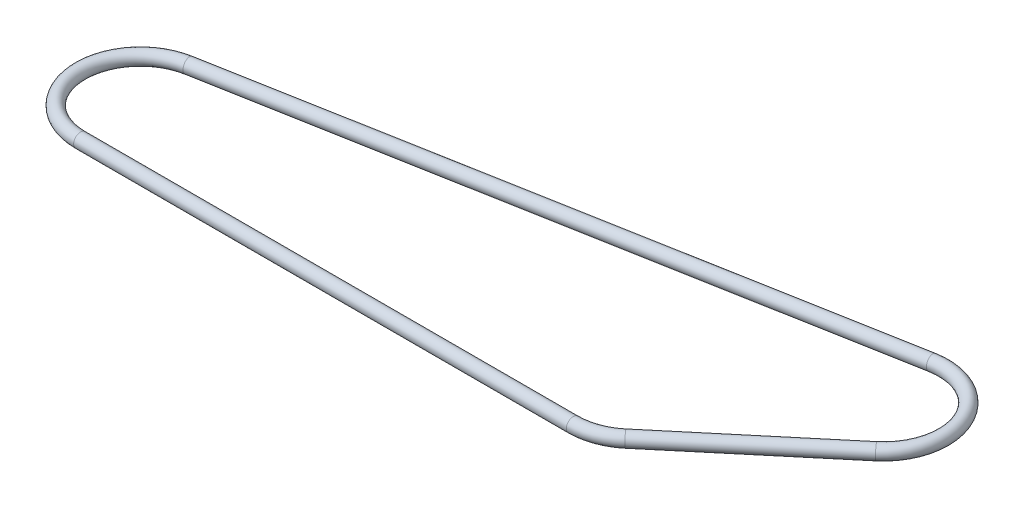
ISO-10303-21;
HEADER;
FILE_DESCRIPTION(('STEP AP214'),'2;1');
FILE_NAME('part.step','',(''),(''),'','','');
FILE_SCHEMA(('AUTOMOTIVE_DESIGN { 1 0 10303 214 1 1 1 1 }'));
ENDSEC;
DATA;
#1=APPLICATION_CONTEXT('core data for automotive mechanical design processes');
#2=APPLICATION_PROTOCOL_DEFINITION('international standard','automotive_design',2000,#1);
#3=PRODUCT_CONTEXT('',#1,'mechanical');
#4=PRODUCT('Part','Part','',(#3));
#5=PRODUCT_RELATED_PRODUCT_CATEGORY('part','',(#4));
#6=PRODUCT_DEFINITION_FORMATION('','',#4);
#7=PRODUCT_DEFINITION_CONTEXT('part definition',#1,'design');
#8=PRODUCT_DEFINITION('design','',#6,#7);
#9=PRODUCT_DEFINITION_SHAPE('','',#8);
#10=(LENGTH_UNIT() NAMED_UNIT(*) SI_UNIT(.MILLI.,.METRE.));
#11=(NAMED_UNIT(*) PLANE_ANGLE_UNIT() SI_UNIT($,.RADIAN.));
#12=(NAMED_UNIT(*) SI_UNIT($,.STERADIAN.) SOLID_ANGLE_UNIT());
#13=UNCERTAINTY_MEASURE_WITH_UNIT(LENGTH_MEASURE(1.E-05),#10,'distance_accuracy_value','');
#14=(GEOMETRIC_REPRESENTATION_CONTEXT(3) GLOBAL_UNCERTAINTY_ASSIGNED_CONTEXT((#13)) GLOBAL_UNIT_ASSIGNED_CONTEXT((#10,
#11,#12)) REPRESENTATION_CONTEXT('',''));
#15=CARTESIAN_POINT('',(0.,0.,0.));
#16=DIRECTION('',(0.,0.,1.));
#17=DIRECTION('',(1.,0.,0.));
#18=AXIS2_PLACEMENT_3D('',#15,#16,#17);
#19=CARTESIAN_POINT('',(228.6,0.,0.));
#20=DIRECTION('',(-1.,0.,0.));
#21=DIRECTION('',(0.,0.,1.));
#22=AXIS2_PLACEMENT_3D('',#19,#20,#21);
#23=CYLINDRICAL_SURFACE('',#22,3.175);
#24=CARTESIAN_POINT('',(228.6,0.,0.));
#25=DIRECTION('',(1.,0.,0.));
#26=DIRECTION('',(0.,0.,-1.));
#27=AXIS2_PLACEMENT_3D('',#24,#25,#26);
#28=CIRCLE('',#27,3.175);
#29=CARTESIAN_POINT('',(228.6,0.,-3.175));
#30=VERTEX_POINT('',#29);
#31=EDGE_CURVE('E12',#30,#30,#28,.T.);
#32=ORIENTED_EDGE('',*,*,#31,.F.);
#33=EDGE_LOOP('',(#32));
#34=FACE_BOUND('',#33,.T.);
#35=CARTESIAN_POINT('',(0.,0.,0.));
#36=DIRECTION('',(1.,0.,0.));
#37=DIRECTION('',(0.,0.,-1.));
#38=AXIS2_PLACEMENT_3D('',#35,#36,#37);
#39=CIRCLE('',#38,3.175);
#40=CARTESIAN_POINT('',(0.,0.,-3.175));
#41=VERTEX_POINT('',#40);
#42=CARTESIAN_POINT('',(-1.72387306772911E-06,3.175,-4.51320987310372E-12));
#43=VERTEX_POINT('',#42);
#44=EDGE_CURVE('E52',#41,#43,#39,.T.);
#45=ORIENTED_EDGE('',*,*,#44,.T.);
#46=CARTESIAN_POINT('',(-1.72387306773131E-06,0.,-4.57966997657877E-13));
#47=DIRECTION('',(0.999999999999853,0.,5.42952153376186E-07));
#48=DIRECTION('',(5.4295215334843E-07,0.,-0.999999999999853));
#49=AXIS2_PLACEMENT_3D('',#46,#47,#48);
#50=CIRCLE('',#49,3.175);
#51=EDGE_CURVE('E64',#43,#41,#50,.T.);
#52=ORIENTED_EDGE('',*,*,#51,.T.);
#53=EDGE_LOOP('',(#45,#52));
#54=FACE_BOUND('',#53,.T.);
#55=ADVANCED_FACE('F49',(#34,#54),#23,.T.);
#56=CARTESIAN_POINT('',(228.59999994985,0.,-27.78125));
#57=DIRECTION('',(0.,1.,0.));
#58=DIRECTION('',(0.,0.,1.));
#59=AXIS2_PLACEMENT_3D('',#56,#57,#58);
#60=TOROIDAL_SURFACE('',#59,27.78125,3.175);
#61=CARTESIAN_POINT('',(246.457443372482,0.,-6.49957793293729));
#62=DIRECTION('',(0.766044440019752,0.,-0.642787613380054));
#63=DIRECTION('',(-0.642787613380054,0.,-0.766044440019752));
#64=AXIS2_PLACEMENT_3D('',#61,#62,#63);
#65=CIRCLE('',#64,3.175);
#66=CARTESIAN_POINT('',(244.4165927,0.,-8.93176903));
#67=VERTEX_POINT('',#66);
#68=EDGE_CURVE('E70',#67,#67,#65,.T.);
#69=ORIENTED_EDGE('',*,*,#68,.F.);
#70=EDGE_LOOP('',(#69));
#71=FACE_BOUND('',#70,.T.);
#72=ORIENTED_EDGE('',*,*,#31,.T.);
#73=EDGE_LOOP('',(#72));
#74=FACE_BOUND('',#73,.T.);
#75=ADVANCED_FACE('F99',(#71,#74),#60,.T.);
#76=CARTESIAN_POINT('',(309.694411896112,0.,-59.5616954174608));
#77=DIRECTION('',(-0.766044440019751,0.,0.642787613380054));
#78=DIRECTION('',(0.642787613380054,0.,0.766044440019752));
#79=AXIS2_PLACEMENT_3D('',#76,#77,#78);
#80=CYLINDRICAL_SURFACE('',#79,3.17499999999998);
#81=CARTESIAN_POINT('',(309.694411896112,0.,-59.5616954174608));
#82=DIRECTION('',(0.766044440019751,0.,-0.642787613380054));
#83=DIRECTION('',(-0.642787613380054,0.,-0.766044440019751));
#84=AXIS2_PLACEMENT_3D('',#81,#82,#83);
#85=CIRCLE('',#84,3.17499999999998);
#86=CARTESIAN_POINT('',(311.735262570184,0.,-57.1295043217326));
#87=VERTEX_POINT('',#86);
#88=EDGE_CURVE('E72',#87,#87,#85,.T.);
#89=ORIENTED_EDGE('',*,*,#88,.F.);
#90=EDGE_LOOP('',(#89));
#91=FACE_BOUND('',#90,.T.);
#92=ORIENTED_EDGE('',*,*,#68,.T.);
#93=EDGE_LOOP('',(#92));
#94=FACE_BOUND('',#93,.T.);
#95=ADVANCED_FACE('F94',(#91,#94),#80,.T.);
#96=CARTESIAN_POINT('',(291.836968497981,0.,-80.8433675050819));
#97=DIRECTION('',(0.,1.,0.));
#98=DIRECTION('',(0.,0.,1.));
#99=AXIS2_PLACEMENT_3D('',#96,#97,#98);
#100=TOROIDAL_SURFACE('',#99,27.78125,3.175);
#101=CARTESIAN_POINT('',(286.867230183181,0.,-108.17648940224));
#102=DIRECTION('',(-0.983869404739097,0.,0.178888217662134));
#103=DIRECTION('',(0.178888217662134,0.,0.983869404739097));
#104=AXIS2_PLACEMENT_3D('',#101,#102,#103);
#105=CIRCLE('',#104,3.175);
#106=CARTESIAN_POINT('',(286.299260090061,0.,-111.300274761915));
#107=VERTEX_POINT('',#106);
#108=EDGE_CURVE('E77',#107,#107,#105,.T.);
#109=CARTESIAN_POINT('',(291.836968497981,0.,-80.8433675050819));
#110=DIRECTION('',(0.,1.,0.));
#111=DIRECTION('',(0.,0.,1.));
#112=AXIS2_PLACEMENT_3D('',#109,#110,#111);
#113=CIRCLE('',#112,30.95625);
#114=EDGE_CURVE('',#87,#107,#113,.T.);
#115=ORIENTED_EDGE('',*,*,#88,.T.);
#116=ORIENTED_EDGE('',*,*,#108,.F.);
#117=ORIENTED_EDGE('',*,*,#114,.T.);
#118=ORIENTED_EDGE('',*,*,#114,.F.);
#119=EDGE_LOOP('',(#115,#117,#116,#118));
#120=FACE_BOUND('',#119,.T.);
#121=ADVANCED_FACE('F91',(#120),#100,.T.);
#122=CARTESIAN_POINT('',(-4.96973837075398,0.,-55.1143706890581));
#123=DIRECTION('',(0.983869404739097,0.,-0.178888217662134));
#124=DIRECTION('',(-0.178888217662134,0.,-0.983869404739097));
#125=AXIS2_PLACEMENT_3D('',#122,#123,#124);
#126=CYLINDRICAL_SURFACE('',#125,3.175);
#127=CARTESIAN_POINT('',(-4.96973837075398,0.,-55.1143706890581));
#128=DIRECTION('',(-0.983869404739097,0.,0.178888217662134));
#129=DIRECTION('',(0.178888217662134,0.,0.983869404739097));
#130=AXIS2_PLACEMENT_3D('',#127,#128,#129);
#131=CIRCLE('',#130,3.175);
#132=CARTESIAN_POINT('',(-4.40176827967671,0.,-51.9905853290115));
#133=VERTEX_POINT('',#132);
#134=EDGE_CURVE('E68',#133,#133,#131,.T.);
#135=ORIENTED_EDGE('',*,*,#134,.F.);
#136=EDGE_LOOP('',(#135));
#137=FACE_BOUND('',#136,.T.);
#138=ORIENTED_EDGE('',*,*,#108,.T.);
#139=EDGE_LOOP('',(#138));
#140=FACE_BOUND('',#139,.T.);
#141=ADVANCED_FACE('F89',(#137,#140),#126,.T.);
#142=CARTESIAN_POINT('',(6.58847977043353E-06,0.,-27.7812499999991));
#143=DIRECTION('',(0.,-1.,0.));
#144=DIRECTION('',(0.,0.,-1.));
#145=AXIS2_PLACEMENT_3D('',#142,#143,#144);
#146=TOROIDAL_SURFACE('',#145,27.7812499999999,3.175);
#147=ORIENTED_EDGE('',*,*,#134,.T.);
#148=EDGE_LOOP('',(#147));
#149=FACE_BOUND('',#148,.T.);
#150=ORIENTED_EDGE('',*,*,#44,.F.);
#151=ORIENTED_EDGE('',*,*,#51,.F.);
#152=EDGE_LOOP('',(#150,#151));
#153=FACE_BOUND('',#152,.T.);
#154=ADVANCED_FACE('F67',(#149,#153),#146,.T.);
#155=CLOSED_SHELL('',(#55,#75,#95,#121,#141,#154));
#156=MANIFOLD_SOLID_BREP('B2',#155);
#157=ADVANCED_BREP_SHAPE_REPRESENTATION('',(#18,#156),#14);
#158=SHAPE_DEFINITION_REPRESENTATION(#9,#157);
ENDSEC;
END-ISO-10303-21;
